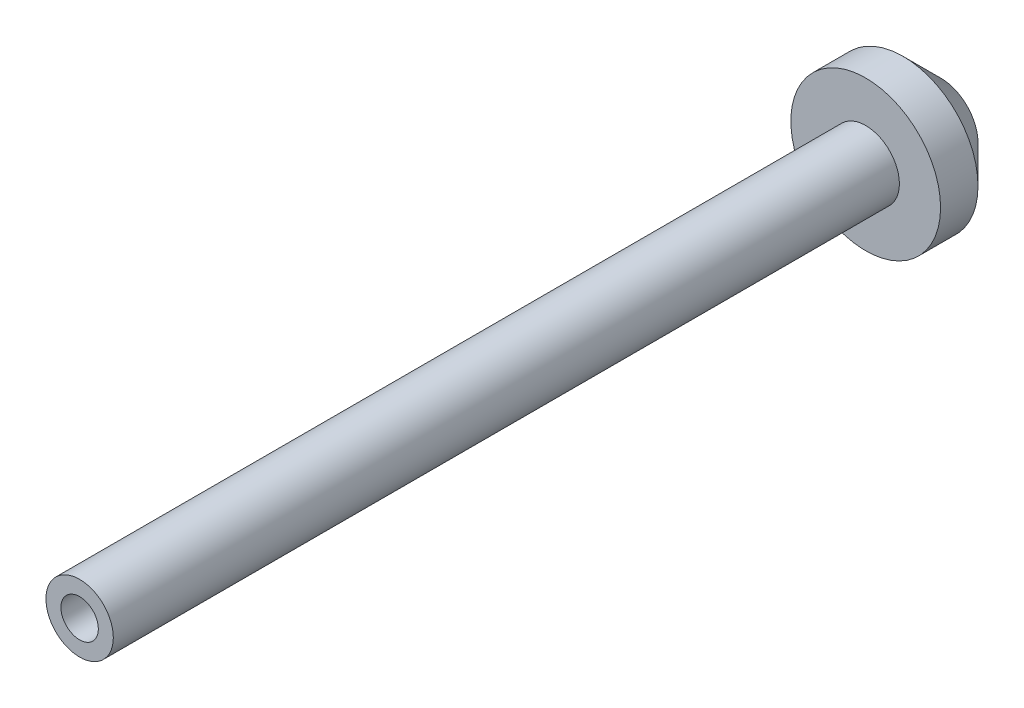
ISO-10303-21;
HEADER;
FILE_DESCRIPTION(('STEP AP214'),'2;1');
FILE_NAME('part.step','',(''),(''),'','','');
FILE_SCHEMA(('AUTOMOTIVE_DESIGN { 1 0 10303 214 1 1 1 1 }'));
ENDSEC;
DATA;
#1=APPLICATION_CONTEXT('core data for automotive mechanical design processes');
#2=APPLICATION_PROTOCOL_DEFINITION('international standard','automotive_design',2000,#1);
#3=PRODUCT_CONTEXT('',#1,'mechanical');
#4=PRODUCT('Part','Part','',(#3));
#5=PRODUCT_RELATED_PRODUCT_CATEGORY('part','',(#4));
#6=PRODUCT_DEFINITION_FORMATION('','',#4);
#7=PRODUCT_DEFINITION_CONTEXT('part definition',#1,'design');
#8=PRODUCT_DEFINITION('design','',#6,#7);
#9=PRODUCT_DEFINITION_SHAPE('','',#8);
#10=(LENGTH_UNIT() NAMED_UNIT(*) SI_UNIT(.MILLI.,.METRE.));
#11=(NAMED_UNIT(*) PLANE_ANGLE_UNIT() SI_UNIT($,.RADIAN.));
#12=(NAMED_UNIT(*) SI_UNIT($,.STERADIAN.) SOLID_ANGLE_UNIT());
#13=UNCERTAINTY_MEASURE_WITH_UNIT(LENGTH_MEASURE(1.E-05),#10,'distance_accuracy_value','');
#14=(GEOMETRIC_REPRESENTATION_CONTEXT(3) GLOBAL_UNCERTAINTY_ASSIGNED_CONTEXT((#13)) GLOBAL_UNIT_ASSIGNED_CONTEXT((#10,
#11,#12)) REPRESENTATION_CONTEXT('',''));
#15=CARTESIAN_POINT('',(0.,0.,0.));
#16=DIRECTION('',(0.,0.,1.));
#17=DIRECTION('',(1.,0.,0.));
#18=AXIS2_PLACEMENT_3D('',#15,#16,#17);
#19=CARTESIAN_POINT('',(0.,0.,5.));
#20=DIRECTION('',(0.,0.,-1.));
#21=DIRECTION('',(-1.,0.,0.));
#22=AXIS2_PLACEMENT_3D('',#19,#20,#21);
#23=CYLINDRICAL_SURFACE('',#22,5.);
#24=CARTESIAN_POINT('',(0.,0.,2.5));
#25=DIRECTION('',(0.,0.,1.));
#26=DIRECTION('',(1.,0.,0.));
#27=AXIS2_PLACEMENT_3D('',#24,#25,#26);
#28=CIRCLE('',#27,5.);
#29=CARTESIAN_POINT('',(5.,0.,2.5));
#30=VERTEX_POINT('',#29);
#31=EDGE_CURVE('E40',#30,#30,#28,.T.);
#32=ORIENTED_EDGE('',*,*,#31,.T.);
#33=EDGE_LOOP('',(#32));
#34=FACE_BOUND('',#33,.T.);
#35=CARTESIAN_POINT('',(0.,0.,5.));
#36=DIRECTION('',(0.,0.,1.));
#37=DIRECTION('',(1.,0.,0.));
#38=AXIS2_PLACEMENT_3D('',#35,#36,#37);
#39=CIRCLE('',#38,5.);
#40=CARTESIAN_POINT('',(5.,0.,5.));
#41=VERTEX_POINT('',#40);
#42=EDGE_CURVE('E48',#41,#41,#39,.T.);
#43=ORIENTED_EDGE('',*,*,#42,.F.);
#44=EDGE_LOOP('',(#43));
#45=FACE_BOUND('',#44,.T.);
#46=ADVANCED_FACE('F32',(#34,#45),#23,.T.);
#47=CARTESIAN_POINT('',(0.,0.,5.));
#48=DIRECTION('',(0.,0.,1.));
#49=DIRECTION('',(1.,0.,0.));
#50=AXIS2_PLACEMENT_3D('',#47,#48,#49);
#51=PLANE('',#50);
#52=CARTESIAN_POINT('',(0.,0.,5.));
#53=DIRECTION('',(0.,0.,1.));
#54=DIRECTION('',(1.,0.,0.));
#55=AXIS2_PLACEMENT_3D('',#52,#53,#54);
#56=CIRCLE('',#55,2.25);
#57=CARTESIAN_POINT('',(2.25,0.,5.));
#58=VERTEX_POINT('',#57);
#59=EDGE_CURVE('E44',#58,#58,#56,.T.);
#60=ORIENTED_EDGE('',*,*,#59,.F.);
#61=EDGE_LOOP('',(#60));
#62=FACE_BOUND('',#61,.T.);
#63=ORIENTED_EDGE('',*,*,#42,.T.);
#64=EDGE_LOOP('',(#63));
#65=FACE_BOUND('',#64,.T.);
#66=ADVANCED_FACE('F84',(#62,#65),#51,.T.);
#67=CARTESIAN_POINT('',(0.,0.,0.));
#68=DIRECTION('',(0.,0.,1.));
#69=DIRECTION('',(1.,0.,0.));
#70=AXIS2_PLACEMENT_3D('',#67,#68,#69);
#71=PLANE('',#70);
#72=CARTESIAN_POINT('',(0.,0.,0.));
#73=DIRECTION('',(0.,0.,1.));
#74=DIRECTION('',(1.,0.,0.));
#75=AXIS2_PLACEMENT_3D('',#72,#73,#74);
#76=CIRCLE('',#75,2.49999999999999);
#77=CARTESIAN_POINT('',(2.49999999999999,0.,0.));
#78=VERTEX_POINT('',#77);
#79=EDGE_CURVE('E10',#78,#78,#76,.F.);
#80=ORIENTED_EDGE('',*,*,#79,.T.);
#81=EDGE_LOOP('',(#80));
#82=FACE_BOUND('',#81,.T.);
#83=ADVANCED_FACE('F80',(#82),#71,.F.);
#84=CARTESIAN_POINT('',(0.,0.,57.5));
#85=DIRECTION('',(0.,0.,-1.));
#86=DIRECTION('',(-1.,0.,0.));
#87=AXIS2_PLACEMENT_3D('',#84,#85,#86);
#88=CYLINDRICAL_SURFACE('',#87,2.25);
#89=CARTESIAN_POINT('',(0.,0.,57.5));
#90=DIRECTION('',(0.,0.,1.));
#91=DIRECTION('',(1.,0.,0.));
#92=AXIS2_PLACEMENT_3D('',#89,#90,#91);
#93=CIRCLE('',#92,2.25);
#94=CARTESIAN_POINT('',(2.25,0.,57.5));
#95=VERTEX_POINT('',#94);
#96=EDGE_CURVE('E52',#95,#95,#93,.T.);
#97=ORIENTED_EDGE('',*,*,#96,.F.);
#98=EDGE_LOOP('',(#97));
#99=FACE_BOUND('',#98,.T.);
#100=ORIENTED_EDGE('',*,*,#59,.T.);
#101=EDGE_LOOP('',(#100));
#102=FACE_BOUND('',#101,.T.);
#103=ADVANCED_FACE('F74',(#99,#102),#88,.T.);
#104=CARTESIAN_POINT('',(0.,0.,57.5));
#105=DIRECTION('',(0.,0.,1.));
#106=DIRECTION('',(1.,0.,0.));
#107=AXIS2_PLACEMENT_3D('',#104,#105,#106);
#108=PLANE('',#107);
#109=CARTESIAN_POINT('',(0.,0.,57.5));
#110=DIRECTION('',(0.,0.,1.));
#111=DIRECTION('',(1.,0.,0.));
#112=AXIS2_PLACEMENT_3D('',#109,#110,#111);
#113=CIRCLE('',#112,1.25);
#114=CARTESIAN_POINT('',(1.25,0.,57.5));
#115=VERTEX_POINT('',#114);
#116=EDGE_CURVE('E57',#115,#115,#113,.T.);
#117=ORIENTED_EDGE('',*,*,#116,.F.);
#118=EDGE_LOOP('',(#117));
#119=FACE_BOUND('',#118,.T.);
#120=ORIENTED_EDGE('',*,*,#96,.T.);
#121=EDGE_LOOP('',(#120));
#122=FACE_BOUND('',#121,.T.);
#123=ADVANCED_FACE('F68',(#119,#122),#108,.T.);
#124=CARTESIAN_POINT('',(0.,0.,47.5));
#125=DIRECTION('',(0.,0.,1.));
#126=DIRECTION('',(1.,0.,0.));
#127=AXIS2_PLACEMENT_3D('',#124,#125,#126);
#128=CYLINDRICAL_SURFACE('',#127,1.25);
#129=CARTESIAN_POINT('',(0.,0.,47.5));
#130=DIRECTION('',(0.,0.,1.));
#131=DIRECTION('',(1.,0.,0.));
#132=AXIS2_PLACEMENT_3D('',#129,#130,#131);
#133=CIRCLE('',#132,1.25);
#134=CARTESIAN_POINT('',(1.25,0.,47.5));
#135=VERTEX_POINT('',#134);
#136=EDGE_CURVE('E56',#135,#135,#133,.T.);
#137=ORIENTED_EDGE('',*,*,#136,.F.);
#138=EDGE_LOOP('',(#137));
#139=FACE_BOUND('',#138,.T.);
#140=ORIENTED_EDGE('',*,*,#116,.T.);
#141=EDGE_LOOP('',(#140));
#142=FACE_BOUND('',#141,.T.);
#143=ADVANCED_FACE('F65',(#139,#142),#128,.F.);
#144=CARTESIAN_POINT('',(0.,0.,47.5));
#145=DIRECTION('',(0.,0.,1.));
#146=DIRECTION('',(1.,0.,0.));
#147=AXIS2_PLACEMENT_3D('',#144,#145,#146);
#148=PLANE('',#147);
#149=ORIENTED_EDGE('',*,*,#136,.T.);
#150=EDGE_LOOP('',(#149));
#151=FACE_BOUND('',#150,.T.);
#152=ADVANCED_FACE('F63',(#151),#148,.T.);
#153=CARTESIAN_POINT('',(0.,0.,2.5));
#154=DIRECTION('',(0.,0.,1.));
#155=DIRECTION('',(1.,0.,0.));
#156=AXIS2_PLACEMENT_3D('',#153,#154,#155);
#157=CONICAL_SURFACE('',#156,5.,0.78539816339745);
#158=ORIENTED_EDGE('',*,*,#79,.F.);
#159=EDGE_LOOP('',(#158));
#160=FACE_BOUND('',#159,.T.);
#161=ORIENTED_EDGE('',*,*,#31,.F.);
#162=EDGE_LOOP('',(#161));
#163=FACE_BOUND('',#162,.T.);
#164=ADVANCED_FACE('F35',(#160,#163),#157,.T.);
#165=CLOSED_SHELL('',(#46,#66,#83,#103,#123,#143,#152,#164));
#166=MANIFOLD_SOLID_BREP('B2',#165);
#167=ADVANCED_BREP_SHAPE_REPRESENTATION('',(#18,#166),#14);
#168=SHAPE_DEFINITION_REPRESENTATION(#9,#167);
ENDSEC;
END-ISO-10303-21;
